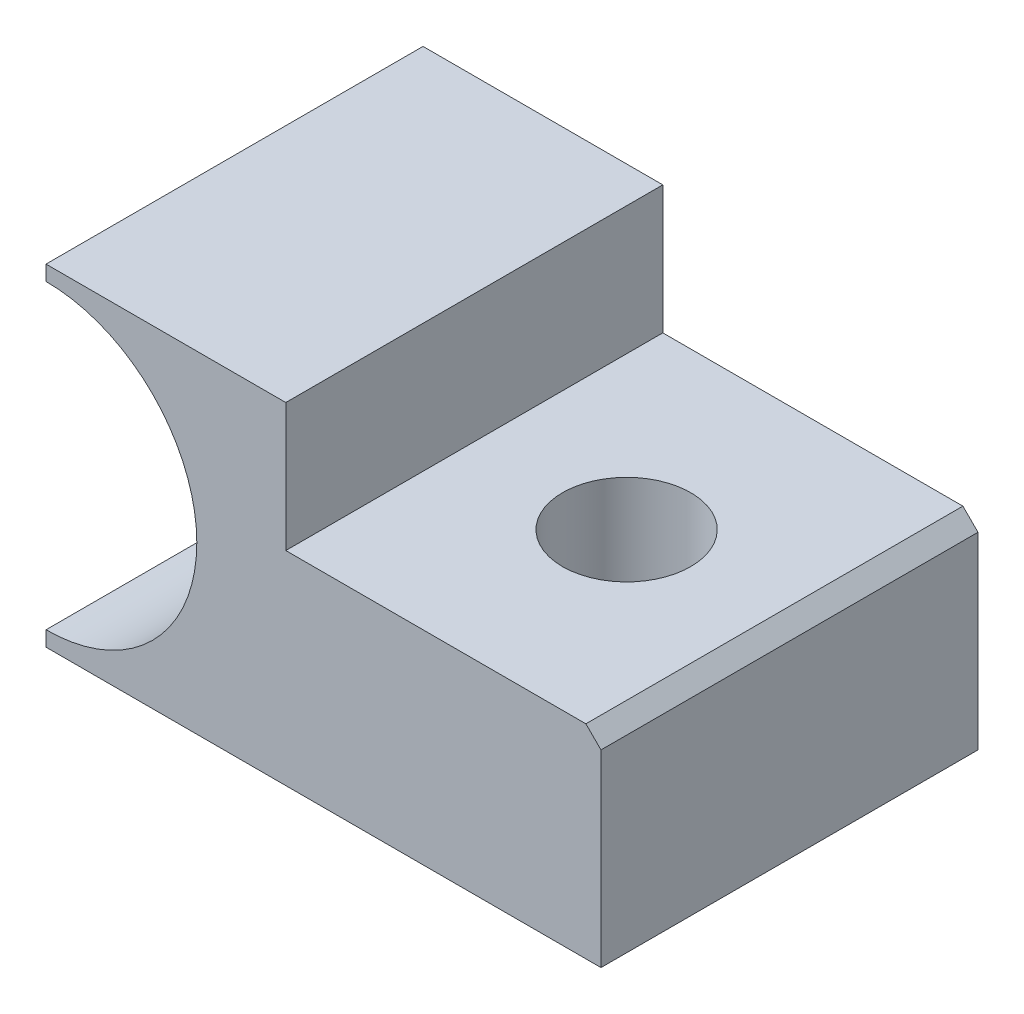
ISO-10303-21;
HEADER;
FILE_DESCRIPTION(('STEP AP214'),'2;1');
FILE_NAME('part.step','',(''),(''),'','','');
FILE_SCHEMA(('AUTOMOTIVE_DESIGN { 1 0 10303 214 1 1 1 1 }'));
ENDSEC;
DATA;
#1=APPLICATION_CONTEXT('core data for automotive mechanical design processes');
#2=APPLICATION_PROTOCOL_DEFINITION('international standard','automotive_design',2000,#1);
#3=PRODUCT_CONTEXT('',#1,'mechanical');
#4=PRODUCT('Part','Part','',(#3));
#5=PRODUCT_RELATED_PRODUCT_CATEGORY('part','',(#4));
#6=PRODUCT_DEFINITION_FORMATION('','',#4);
#7=PRODUCT_DEFINITION_CONTEXT('part definition',#1,'design');
#8=PRODUCT_DEFINITION('design','',#6,#7);
#9=PRODUCT_DEFINITION_SHAPE('','',#8);
#10=(LENGTH_UNIT() NAMED_UNIT(*) SI_UNIT(.MILLI.,.METRE.));
#11=(NAMED_UNIT(*) PLANE_ANGLE_UNIT() SI_UNIT($,.RADIAN.));
#12=(NAMED_UNIT(*) SI_UNIT($,.STERADIAN.) SOLID_ANGLE_UNIT());
#13=UNCERTAINTY_MEASURE_WITH_UNIT(LENGTH_MEASURE(1.E-05),#10,'distance_accuracy_value','');
#14=(GEOMETRIC_REPRESENTATION_CONTEXT(3) GLOBAL_UNCERTAINTY_ASSIGNED_CONTEXT((#13)) GLOBAL_UNIT_ASSIGNED_CONTEXT((#10,
#11,#12)) REPRESENTATION_CONTEXT('',''));
#15=CARTESIAN_POINT('',(0.,0.,0.));
#16=DIRECTION('',(0.,0.,1.));
#17=DIRECTION('',(1.,0.,0.));
#18=AXIS2_PLACEMENT_3D('',#15,#16,#17);
#19=CARTESIAN_POINT('',(0.,27.94,31.75));
#20=DIRECTION('',(0.,-1.,0.));
#21=DIRECTION('',(0.,0.,-1.));
#22=AXIS2_PLACEMENT_3D('',#19,#20,#21);
#23=PLANE('',#22);
#24=DIRECTION('',(-1.,0.,0.));
#25=VECTOR('',#24,1.);
#26=CARTESIAN_POINT('',(0.,27.94,0.));
#27=LINE('',#26,#25);
#28=CARTESIAN_POINT('',(20.193,27.94,0.));
#29=VERTEX_POINT('',#28);
#30=CARTESIAN_POINT('',(0.,27.94,0.));
#31=VERTEX_POINT('',#30);
#32=EDGE_CURVE('E146',#29,#31,#27,.T.);
#33=ORIENTED_EDGE('',*,*,#32,.T.);
#34=DIRECTION('',(0.,0.,-1.));
#35=VECTOR('',#34,1.);
#36=CARTESIAN_POINT('',(0.,27.94,31.75));
#37=LINE('',#36,#35);
#38=CARTESIAN_POINT('',(0.,27.94,31.75));
#39=VERTEX_POINT('',#38);
#40=EDGE_CURVE('E127',#39,#31,#37,.T.);
#41=ORIENTED_EDGE('',*,*,#40,.F.);
#42=DIRECTION('',(-1.,0.,0.));
#43=VECTOR('',#42,1.);
#44=CARTESIAN_POINT('',(0.,27.94,31.75));
#45=LINE('',#44,#43);
#46=CARTESIAN_POINT('',(20.193,27.94,31.75));
#47=VERTEX_POINT('',#46);
#48=EDGE_CURVE('E134',#47,#39,#45,.T.);
#49=ORIENTED_EDGE('',*,*,#48,.F.);
#50=DIRECTION('',(0.,0.,-1.));
#51=VECTOR('',#50,1.);
#52=CARTESIAN_POINT('',(20.193,27.94,31.75));
#53=LINE('',#52,#51);
#54=EDGE_CURVE('E166',#47,#29,#53,.T.);
#55=ORIENTED_EDGE('',*,*,#54,.T.);
#56=EDGE_LOOP('',(#33,#41,#49,#55));
#57=FACE_BOUND('',#56,.T.);
#58=ADVANCED_FACE('F51',(#57),#23,.F.);
#59=CARTESIAN_POINT('',(0.,26.67,31.75));
#60=DIRECTION('',(1.,0.,0.));
#61=DIRECTION('',(0.,0.,-1.));
#62=AXIS2_PLACEMENT_3D('',#59,#60,#61);
#63=PLANE('',#62);
#64=DIRECTION('',(0.,-1.,0.));
#65=VECTOR('',#64,1.);
#66=CARTESIAN_POINT('',(0.,26.67,0.));
#67=LINE('',#66,#65);
#68=CARTESIAN_POINT('',(0.,26.67,0.));
#69=VERTEX_POINT('',#68);
#70=EDGE_CURVE('E179',#31,#69,#67,.T.);
#71=ORIENTED_EDGE('',*,*,#70,.T.);
#72=DIRECTION('',(0.,0.,-1.));
#73=VECTOR('',#72,1.);
#74=CARTESIAN_POINT('',(0.,26.67,31.75));
#75=LINE('',#74,#73);
#76=CARTESIAN_POINT('',(0.,26.67,31.75));
#77=VERTEX_POINT('',#76);
#78=EDGE_CURVE('E130',#77,#69,#75,.T.);
#79=ORIENTED_EDGE('',*,*,#78,.F.);
#80=DIRECTION('',(0.,-1.,0.));
#81=VECTOR('',#80,1.);
#82=CARTESIAN_POINT('',(0.,26.67,31.75));
#83=LINE('',#82,#81);
#84=EDGE_CURVE('E123',#39,#77,#83,.T.);
#85=ORIENTED_EDGE('',*,*,#84,.F.);
#86=ORIENTED_EDGE('',*,*,#40,.T.);
#87=EDGE_LOOP('',(#71,#79,#85,#86));
#88=FACE_BOUND('',#87,.T.);
#89=ADVANCED_FACE('F125',(#88),#63,.F.);
#90=CARTESIAN_POINT('',(0.,13.97,31.75));
#91=DIRECTION('',(0.,0.,-1.));
#92=DIRECTION('',(-1.,0.,0.));
#93=AXIS2_PLACEMENT_3D('',#90,#91,#92);
#94=CYLINDRICAL_SURFACE('',#93,12.7);
#95=CARTESIAN_POINT('',(0.,13.97,0.));
#96=DIRECTION('',(0.,0.,-1.));
#97=DIRECTION('',(1.,0.,0.));
#98=AXIS2_PLACEMENT_3D('',#95,#96,#97);
#99=CIRCLE('',#98,12.7);
#100=CARTESIAN_POINT('',(0.,1.27,0.));
#101=VERTEX_POINT('',#100);
#102=EDGE_CURVE('E177',#69,#101,#99,.T.);
#103=ORIENTED_EDGE('',*,*,#102,.T.);
#104=DIRECTION('',(0.,0.,-1.));
#105=VECTOR('',#104,1.);
#106=CARTESIAN_POINT('',(0.,1.27,31.75));
#107=LINE('',#106,#105);
#108=CARTESIAN_POINT('',(0.,1.27,31.75));
#109=VERTEX_POINT('',#108);
#110=EDGE_CURVE('E151',#109,#101,#107,.T.);
#111=ORIENTED_EDGE('',*,*,#110,.F.);
#112=CARTESIAN_POINT('',(0.,13.97,31.75));
#113=DIRECTION('',(0.,0.,-1.));
#114=DIRECTION('',(1.,0.,0.));
#115=AXIS2_PLACEMENT_3D('',#112,#113,#114);
#116=CIRCLE('',#115,12.7);
#117=EDGE_CURVE('E133',#77,#109,#116,.T.);
#118=ORIENTED_EDGE('',*,*,#117,.F.);
#119=ORIENTED_EDGE('',*,*,#78,.T.);
#120=EDGE_LOOP('',(#103,#111,#118,#119));
#121=FACE_BOUND('',#120,.T.);
#122=ADVANCED_FACE('F226',(#121),#94,.F.);
#123=CARTESIAN_POINT('',(0.,1.27,31.75));
#124=DIRECTION('',(1.,0.,0.));
#125=DIRECTION('',(0.,1.,0.));
#126=AXIS2_PLACEMENT_3D('',#123,#124,#125);
#127=PLANE('',#126);
#128=DIRECTION('',(0.,-1.,0.));
#129=VECTOR('',#128,1.);
#130=CARTESIAN_POINT('',(0.,1.27,0.));
#131=LINE('',#130,#129);
#132=CARTESIAN_POINT('',(0.,0.,0.));
#133=VERTEX_POINT('',#132);
#134=EDGE_CURVE('E175',#101,#133,#131,.T.);
#135=ORIENTED_EDGE('',*,*,#134,.T.);
#136=DIRECTION('',(0.,0.,-1.));
#137=VECTOR('',#136,1.);
#138=CARTESIAN_POINT('',(0.,0.,31.75));
#139=LINE('',#138,#137);
#140=CARTESIAN_POINT('',(0.,0.,31.75));
#141=VERTEX_POINT('',#140);
#142=EDGE_CURVE('E157',#141,#133,#139,.T.);
#143=ORIENTED_EDGE('',*,*,#142,.F.);
#144=DIRECTION('',(0.,-1.,0.));
#145=VECTOR('',#144,1.);
#146=CARTESIAN_POINT('',(0.,1.27,31.75));
#147=LINE('',#146,#145);
#148=EDGE_CURVE('E190',#109,#141,#147,.T.);
#149=ORIENTED_EDGE('',*,*,#148,.F.);
#150=ORIENTED_EDGE('',*,*,#110,.T.);
#151=EDGE_LOOP('',(#135,#143,#149,#150));
#152=FACE_BOUND('',#151,.T.);
#153=ADVANCED_FACE('F223',(#152),#127,.F.);
#154=CARTESIAN_POINT('',(0.,0.,31.75));
#155=DIRECTION('',(0.,1.,0.));
#156=DIRECTION('',(0.,0.,1.));
#157=AXIS2_PLACEMENT_3D('',#154,#155,#156);
#158=PLANE('',#157);
#159=CARTESIAN_POINT('',(33.02,0.,15.875));
#160=DIRECTION('',(0.,1.,0.));
#161=DIRECTION('',(0.,0.,1.));
#162=AXIS2_PLACEMENT_3D('',#159,#160,#161);
#163=CIRCLE('',#162,5.3975);
#164=CARTESIAN_POINT('',(33.02,0.,21.2725));
#165=VERTEX_POINT('',#164);
#166=EDGE_CURVE('E182',#165,#165,#163,.T.);
#167=ORIENTED_EDGE('',*,*,#166,.T.);
#168=EDGE_LOOP('',(#167));
#169=FACE_BOUND('',#168,.T.);
#170=DIRECTION('',(1.,0.,0.));
#171=VECTOR('',#170,1.);
#172=CARTESIAN_POINT('',(0.,0.,0.));
#173=LINE('',#172,#171);
#174=CARTESIAN_POINT('',(46.736,0.,0.));
#175=VERTEX_POINT('',#174);
#176=EDGE_CURVE('E173',#133,#175,#173,.T.);
#177=ORIENTED_EDGE('',*,*,#176,.T.);
#178=DIRECTION('',(0.,0.,-1.));
#179=VECTOR('',#178,1.);
#180=CARTESIAN_POINT('',(46.736,0.,31.75));
#181=LINE('',#180,#179);
#182=CARTESIAN_POINT('',(46.736,0.,31.75));
#183=VERTEX_POINT('',#182);
#184=EDGE_CURVE('E160',#183,#175,#181,.T.);
#185=ORIENTED_EDGE('',*,*,#184,.F.);
#186=DIRECTION('',(1.,0.,0.));
#187=VECTOR('',#186,1.);
#188=CARTESIAN_POINT('',(0.,0.,31.75));
#189=LINE('',#188,#187);
#190=EDGE_CURVE('E188',#141,#183,#189,.T.);
#191=ORIENTED_EDGE('',*,*,#190,.F.);
#192=ORIENTED_EDGE('',*,*,#142,.T.);
#193=EDGE_LOOP('',(#177,#185,#191,#192));
#194=FACE_BOUND('',#193,.T.);
#195=ADVANCED_FACE('F219',(#169,#194),#158,.F.);
#196=CARTESIAN_POINT('',(46.736,0.,31.75));
#197=DIRECTION('',(-1.,0.,0.));
#198=DIRECTION('',(0.,0.,1.));
#199=AXIS2_PLACEMENT_3D('',#196,#197,#198);
#200=PLANE('',#199);
#201=DIRECTION('',(0.,1.,0.));
#202=VECTOR('',#201,1.);
#203=CARTESIAN_POINT('',(46.736,0.,0.));
#204=LINE('',#203,#202);
#205=CARTESIAN_POINT('',(46.736,15.875,0.));
#206=VERTEX_POINT('',#205);
#207=EDGE_CURVE('E171',#175,#206,#204,.T.);
#208=ORIENTED_EDGE('',*,*,#207,.T.);
#209=DIRECTION('',(0.,0.,1.));
#210=VECTOR('',#209,1.);
#211=CARTESIAN_POINT('',(46.736,15.875,31.75));
#212=LINE('',#211,#210);
#213=CARTESIAN_POINT('',(46.736,15.875,31.75));
#214=VERTEX_POINT('',#213);
#215=EDGE_CURVE('E60',#206,#214,#212,.T.);
#216=ORIENTED_EDGE('',*,*,#215,.T.);
#217=DIRECTION('',(0.,1.,0.));
#218=VECTOR('',#217,1.);
#219=CARTESIAN_POINT('',(46.736,0.,31.75));
#220=LINE('',#219,#218);
#221=EDGE_CURVE('E186',#183,#214,#220,.T.);
#222=ORIENTED_EDGE('',*,*,#221,.F.);
#223=ORIENTED_EDGE('',*,*,#184,.T.);
#224=EDGE_LOOP('',(#208,#216,#222,#223));
#225=FACE_BOUND('',#224,.T.);
#226=ADVANCED_FACE('F205',(#225),#200,.F.);
#227=CARTESIAN_POINT('',(20.193,17.145,31.75));
#228=DIRECTION('',(0.,-1.,0.));
#229=DIRECTION('',(0.,0.,-1.));
#230=AXIS2_PLACEMENT_3D('',#227,#228,#229);
#231=PLANE('',#230);
#232=CARTESIAN_POINT('',(33.02,17.145,15.875));
#233=DIRECTION('',(0.,1.,0.));
#234=DIRECTION('',(0.,0.,1.));
#235=AXIS2_PLACEMENT_3D('',#232,#233,#234);
#236=CIRCLE('',#235,5.3975);
#237=CARTESIAN_POINT('',(33.02,17.145,21.2725));
#238=VERTEX_POINT('',#237);
#239=EDGE_CURVE('E195',#238,#238,#236,.T.);
#240=ORIENTED_EDGE('',*,*,#239,.F.);
#241=EDGE_LOOP('',(#240));
#242=FACE_BOUND('',#241,.T.);
#243=DIRECTION('',(-1.,0.,0.));
#244=VECTOR('',#243,1.);
#245=CARTESIAN_POINT('',(20.193,17.145,31.75));
#246=LINE('',#245,#244);
#247=CARTESIAN_POINT('',(45.466,17.145,31.75));
#248=VERTEX_POINT('',#247);
#249=CARTESIAN_POINT('',(20.193,17.145,31.75));
#250=VERTEX_POINT('',#249);
#251=EDGE_CURVE('E184',#248,#250,#246,.T.);
#252=ORIENTED_EDGE('',*,*,#251,.F.);
#253=DIRECTION('',(0.,0.,-1.));
#254=VECTOR('',#253,1.);
#255=CARTESIAN_POINT('',(45.466,17.145,31.75));
#256=LINE('',#255,#254);
#257=CARTESIAN_POINT('',(45.466,17.145,0.));
#258=VERTEX_POINT('',#257);
#259=EDGE_CURVE('E147',#248,#258,#256,.T.);
#260=ORIENTED_EDGE('',*,*,#259,.T.);
#261=DIRECTION('',(-1.,0.,0.));
#262=VECTOR('',#261,1.);
#263=CARTESIAN_POINT('',(20.193,17.145,0.));
#264=LINE('',#263,#262);
#265=CARTESIAN_POINT('',(20.193,17.145,0.));
#266=VERTEX_POINT('',#265);
#267=EDGE_CURVE('E169',#258,#266,#264,.T.);
#268=ORIENTED_EDGE('',*,*,#267,.T.);
#269=DIRECTION('',(0.,0.,-1.));
#270=VECTOR('',#269,1.);
#271=CARTESIAN_POINT('',(20.193,17.145,31.75));
#272=LINE('',#271,#270);
#273=EDGE_CURVE('E163',#250,#266,#272,.T.);
#274=ORIENTED_EDGE('',*,*,#273,.F.);
#275=EDGE_LOOP('',(#252,#260,#268,#274));
#276=FACE_BOUND('',#275,.T.);
#277=ADVANCED_FACE('F201',(#242,#276),#231,.F.);
#278=CARTESIAN_POINT('',(20.193,27.94,31.75));
#279=DIRECTION('',(-1.,0.,0.));
#280=DIRECTION('',(0.,0.,1.));
#281=AXIS2_PLACEMENT_3D('',#278,#279,#280);
#282=PLANE('',#281);
#283=DIRECTION('',(0.,1.,0.));
#284=VECTOR('',#283,1.);
#285=CARTESIAN_POINT('',(20.193,27.94,0.));
#286=LINE('',#285,#284);
#287=EDGE_CURVE('E143',#266,#29,#286,.T.);
#288=ORIENTED_EDGE('',*,*,#287,.T.);
#289=ORIENTED_EDGE('',*,*,#54,.F.);
#290=DIRECTION('',(0.,1.,0.));
#291=VECTOR('',#290,1.);
#292=CARTESIAN_POINT('',(20.193,27.94,31.75));
#293=LINE('',#292,#291);
#294=EDGE_CURVE('E139',#250,#47,#293,.T.);
#295=ORIENTED_EDGE('',*,*,#294,.F.);
#296=ORIENTED_EDGE('',*,*,#273,.T.);
#297=EDGE_LOOP('',(#288,#289,#295,#296));
#298=FACE_BOUND('',#297,.T.);
#299=ADVANCED_FACE('F204',(#298),#282,.F.);
#300=CARTESIAN_POINT('',(0.,13.97,31.75));
#301=DIRECTION('',(0.,0.,1.));
#302=DIRECTION('',(1.,0.,0.));
#303=AXIS2_PLACEMENT_3D('',#300,#301,#302);
#304=PLANE('',#303);
#305=ORIENTED_EDGE('',*,*,#221,.T.);
#306=DIRECTION('',(0.707106781186546,-0.70710678118655,0.));
#307=VECTOR('',#306,1.);
#308=CARTESIAN_POINT('',(24.3205000000001,38.2905,31.75));
#309=LINE('',#308,#307);
#310=EDGE_CURVE('E11',#214,#248,#309,.F.);
#311=ORIENTED_EDGE('',*,*,#310,.T.);
#312=ORIENTED_EDGE('',*,*,#251,.T.);
#313=ORIENTED_EDGE('',*,*,#294,.T.);
#314=ORIENTED_EDGE('',*,*,#48,.T.);
#315=ORIENTED_EDGE('',*,*,#84,.T.);
#316=ORIENTED_EDGE('',*,*,#117,.T.);
#317=ORIENTED_EDGE('',*,*,#148,.T.);
#318=ORIENTED_EDGE('',*,*,#190,.T.);
#319=EDGE_LOOP('',(#305,#311,#312,#313,#314,#315,#316,#317,#318));
#320=FACE_BOUND('',#319,.T.);
#321=ADVANCED_FACE('F137',(#320),#304,.T.);
#322=CARTESIAN_POINT('',(0.,13.97,0.));
#323=DIRECTION('',(0.,0.,1.));
#324=DIRECTION('',(1.,0.,0.));
#325=AXIS2_PLACEMENT_3D('',#322,#323,#324);
#326=PLANE('',#325);
#327=ORIENTED_EDGE('',*,*,#267,.F.);
#328=DIRECTION('',(-0.707106781186546,0.70710678118655,0.));
#329=VECTOR('',#328,1.);
#330=CARTESIAN_POINT('',(45.466,17.145,0.));
#331=LINE('',#330,#329);
#332=EDGE_CURVE('E74',#258,#206,#331,.F.);
#333=ORIENTED_EDGE('',*,*,#332,.T.);
#334=ORIENTED_EDGE('',*,*,#207,.F.);
#335=ORIENTED_EDGE('',*,*,#176,.F.);
#336=ORIENTED_EDGE('',*,*,#134,.F.);
#337=ORIENTED_EDGE('',*,*,#102,.F.);
#338=ORIENTED_EDGE('',*,*,#70,.F.);
#339=ORIENTED_EDGE('',*,*,#32,.F.);
#340=ORIENTED_EDGE('',*,*,#287,.F.);
#341=EDGE_LOOP('',(#327,#333,#334,#335,#336,#337,#338,#339,#340));
#342=FACE_BOUND('',#341,.T.);
#343=ADVANCED_FACE('F216',(#342),#326,.F.);
#344=CARTESIAN_POINT('',(33.02,17.145,15.875));
#345=DIRECTION('',(0.,1.,0.));
#346=DIRECTION('',(0.,0.,1.));
#347=AXIS2_PLACEMENT_3D('',#344,#345,#346);
#348=CYLINDRICAL_SURFACE('',#347,5.3975);
#349=ORIENTED_EDGE('',*,*,#166,.F.);
#350=EDGE_LOOP('',(#349));
#351=FACE_BOUND('',#350,.T.);
#352=ORIENTED_EDGE('',*,*,#239,.T.);
#353=EDGE_LOOP('',(#352));
#354=FACE_BOUND('',#353,.T.);
#355=ADVANCED_FACE('F199',(#351,#354),#348,.F.);
#356=CARTESIAN_POINT('',(45.466,17.145,31.75));
#357=DIRECTION('',(-0.70710678118655,-0.707106781186546,0.));
#358=DIRECTION('',(0.,0.,-1.));
#359=AXIS2_PLACEMENT_3D('',#356,#357,#358);
#360=PLANE('',#359);
#361=ORIENTED_EDGE('',*,*,#310,.F.);
#362=ORIENTED_EDGE('',*,*,#215,.F.);
#363=ORIENTED_EDGE('',*,*,#332,.F.);
#364=ORIENTED_EDGE('',*,*,#259,.F.);
#365=EDGE_LOOP('',(#361,#362,#363,#364));
#366=FACE_BOUND('',#365,.T.);
#367=ADVANCED_FACE('F54',(#366),#360,.F.);
#368=CLOSED_SHELL('',(#58,#89,#122,#153,#195,#226,#277,#299,#321,#343,#355,#367));
#369=MANIFOLD_SOLID_BREP('B2',#368);
#370=ADVANCED_BREP_SHAPE_REPRESENTATION('',(#18,#369),#14);
#371=SHAPE_DEFINITION_REPRESENTATION(#9,#370);
ENDSEC;
END-ISO-10303-21;
